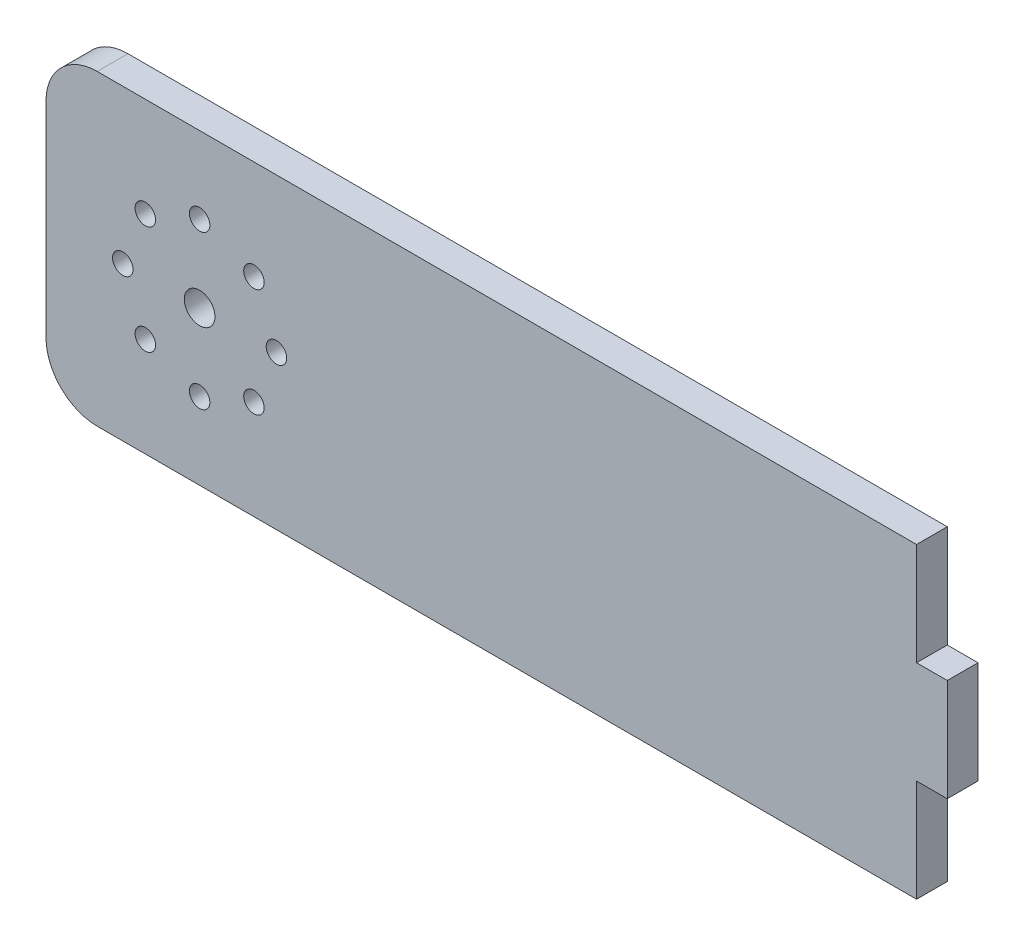
ISO-10303-21;
HEADER;
FILE_DESCRIPTION(('STEP AP214'),'2;1');
FILE_NAME('part.step','',(''),(''),'','','');
FILE_SCHEMA(('AUTOMOTIVE_DESIGN { 1 0 10303 214 1 1 1 1 }'));
ENDSEC;
DATA;
#1=APPLICATION_CONTEXT('core data for automotive mechanical design processes');
#2=APPLICATION_PROTOCOL_DEFINITION('international standard','automotive_design',2000,#1);
#3=PRODUCT_CONTEXT('',#1,'mechanical');
#4=PRODUCT('Part','Part','',(#3));
#5=PRODUCT_RELATED_PRODUCT_CATEGORY('part','',(#4));
#6=PRODUCT_DEFINITION_FORMATION('','',#4);
#7=PRODUCT_DEFINITION_CONTEXT('part definition',#1,'design');
#8=PRODUCT_DEFINITION('design','',#6,#7);
#9=PRODUCT_DEFINITION_SHAPE('','',#8);
#10=(LENGTH_UNIT() NAMED_UNIT(*) SI_UNIT(.MILLI.,.METRE.));
#11=(NAMED_UNIT(*) PLANE_ANGLE_UNIT() SI_UNIT($,.RADIAN.));
#12=(NAMED_UNIT(*) SI_UNIT($,.STERADIAN.) SOLID_ANGLE_UNIT());
#13=UNCERTAINTY_MEASURE_WITH_UNIT(LENGTH_MEASURE(1.E-05),#10,'distance_accuracy_value','');
#14=(GEOMETRIC_REPRESENTATION_CONTEXT(3) GLOBAL_UNCERTAINTY_ASSIGNED_CONTEXT((#13)) GLOBAL_UNIT_ASSIGNED_CONTEXT((#10,
#11,#12)) REPRESENTATION_CONTEXT('',''));
#15=CARTESIAN_POINT('',(0.,0.,0.));
#16=DIRECTION('',(0.,0.,1.));
#17=DIRECTION('',(1.,0.,0.));
#18=AXIS2_PLACEMENT_3D('',#15,#16,#17);
#19=CARTESIAN_POINT('',(0.,30.,3.));
#20=DIRECTION('',(0.,1.,0.));
#21=DIRECTION('',(0.,0.,1.));
#22=AXIS2_PLACEMENT_3D('',#19,#20,#21);
#23=PLANE('',#22);
#24=DIRECTION('',(1.,0.,0.));
#25=VECTOR('',#24,1.);
#26=CARTESIAN_POINT('',(0.,30.,0.));
#27=LINE('',#26,#25);
#28=CARTESIAN_POINT('',(5.,30.,0.));
#29=VERTEX_POINT('',#28);
#30=CARTESIAN_POINT('',(85.,30.,0.));
#31=VERTEX_POINT('',#30);
#32=EDGE_CURVE('E192',#29,#31,#27,.T.);
#33=ORIENTED_EDGE('',*,*,#32,.F.);
#34=DIRECTION('',(0.,0.,-1.));
#35=VECTOR('',#34,1.);
#36=CARTESIAN_POINT('',(5.,30.,3.));
#37=LINE('',#36,#35);
#38=CARTESIAN_POINT('',(5.,30.,3.));
#39=VERTEX_POINT('',#38);
#40=EDGE_CURVE('E11',#29,#39,#37,.F.);
#41=ORIENTED_EDGE('',*,*,#40,.T.);
#42=DIRECTION('',(1.,0.,0.));
#43=VECTOR('',#42,1.);
#44=CARTESIAN_POINT('',(0.,30.,3.));
#45=LINE('',#44,#43);
#46=CARTESIAN_POINT('',(85.,30.,3.));
#47=VERTEX_POINT('',#46);
#48=EDGE_CURVE('E179',#39,#47,#45,.T.);
#49=ORIENTED_EDGE('',*,*,#48,.T.);
#50=DIRECTION('',(0.,0.,-1.));
#51=VECTOR('',#50,1.);
#52=CARTESIAN_POINT('',(85.,30.,3.));
#53=LINE('',#52,#51);
#54=EDGE_CURVE('E211',#47,#31,#53,.T.);
#55=ORIENTED_EDGE('',*,*,#54,.T.);
#56=EDGE_LOOP('',(#33,#41,#49,#55));
#57=FACE_BOUND('',#56,.T.);
#58=ADVANCED_FACE('F41',(#57),#23,.T.);
#59=CARTESIAN_POINT('',(0.,0.,3.));
#60=DIRECTION('',(-1.,0.,0.));
#61=DIRECTION('',(0.,0.,1.));
#62=AXIS2_PLACEMENT_3D('',#59,#60,#61);
#63=PLANE('',#62);
#64=DIRECTION('',(0.,1.,0.));
#65=VECTOR('',#64,1.);
#66=CARTESIAN_POINT('',(0.,0.,0.));
#67=LINE('',#66,#65);
#68=CARTESIAN_POINT('',(0.,5.,0.));
#69=VERTEX_POINT('',#68);
#70=CARTESIAN_POINT('',(0.,25.,0.));
#71=VERTEX_POINT('',#70);
#72=EDGE_CURVE('E176',#69,#71,#67,.T.);
#73=ORIENTED_EDGE('',*,*,#72,.F.);
#74=DIRECTION('',(0.,0.,-1.));
#75=VECTOR('',#74,1.);
#76=CARTESIAN_POINT('',(0.,5.,3.));
#77=LINE('',#76,#75);
#78=CARTESIAN_POINT('',(0.,5.,3.));
#79=VERTEX_POINT('',#78);
#80=EDGE_CURVE('E165',#69,#79,#77,.F.);
#81=ORIENTED_EDGE('',*,*,#80,.T.);
#82=DIRECTION('',(0.,1.,0.));
#83=VECTOR('',#82,1.);
#84=CARTESIAN_POINT('',(0.,0.,3.));
#85=LINE('',#84,#83);
#86=CARTESIAN_POINT('',(0.,25.,3.));
#87=VERTEX_POINT('',#86);
#88=EDGE_CURVE('E129',#79,#87,#85,.T.);
#89=ORIENTED_EDGE('',*,*,#88,.T.);
#90=DIRECTION('',(0.,0.,-1.));
#91=VECTOR('',#90,1.);
#92=CARTESIAN_POINT('',(0.,25.,3.));
#93=LINE('',#92,#91);
#94=EDGE_CURVE('E161',#87,#71,#93,.T.);
#95=ORIENTED_EDGE('',*,*,#94,.T.);
#96=EDGE_LOOP('',(#73,#81,#89,#95));
#97=FACE_BOUND('',#96,.T.);
#98=ADVANCED_FACE('F173',(#97),#63,.T.);
#99=CARTESIAN_POINT('',(0.,0.,3.));
#100=DIRECTION('',(0.,1.,0.));
#101=DIRECTION('',(0.,0.,1.));
#102=AXIS2_PLACEMENT_3D('',#99,#100,#101);
#103=PLANE('',#102);
#104=DIRECTION('',(1.,0.,0.));
#105=VECTOR('',#104,1.);
#106=CARTESIAN_POINT('',(0.,0.,3.));
#107=LINE('',#106,#105);
#108=CARTESIAN_POINT('',(5.,0.,3.));
#109=VERTEX_POINT('',#108);
#110=CARTESIAN_POINT('',(85.,0.,3.));
#111=VERTEX_POINT('',#110);
#112=EDGE_CURVE('E117',#109,#111,#107,.T.);
#113=ORIENTED_EDGE('',*,*,#112,.F.);
#114=DIRECTION('',(0.,0.,-1.));
#115=VECTOR('',#114,1.);
#116=CARTESIAN_POINT('',(5.,0.,0.));
#117=LINE('',#116,#115);
#118=CARTESIAN_POINT('',(5.,0.,0.));
#119=VERTEX_POINT('',#118);
#120=EDGE_CURVE('E146',#109,#119,#117,.T.);
#121=ORIENTED_EDGE('',*,*,#120,.T.);
#122=DIRECTION('',(1.,0.,0.));
#123=VECTOR('',#122,1.);
#124=CARTESIAN_POINT('',(0.,0.,0.));
#125=LINE('',#124,#123);
#126=CARTESIAN_POINT('',(85.,0.,0.));
#127=VERTEX_POINT('',#126);
#128=EDGE_CURVE('E143',#119,#127,#125,.T.);
#129=ORIENTED_EDGE('',*,*,#128,.T.);
#130=DIRECTION('',(0.,0.,-1.));
#131=VECTOR('',#130,1.);
#132=CARTESIAN_POINT('',(85.,0.,3.));
#133=LINE('',#132,#131);
#134=EDGE_CURVE('E135',#111,#127,#133,.T.);
#135=ORIENTED_EDGE('',*,*,#134,.F.);
#136=EDGE_LOOP('',(#113,#121,#129,#135));
#137=FACE_BOUND('',#136,.T.);
#138=ADVANCED_FACE('F141',(#137),#103,.F.);
#139=CARTESIAN_POINT('',(85.,0.,3.));
#140=DIRECTION('',(-1.,0.,0.));
#141=DIRECTION('',(0.,0.,1.));
#142=AXIS2_PLACEMENT_3D('',#139,#140,#141);
#143=PLANE('',#142);
#144=DIRECTION('',(0.,1.,0.));
#145=VECTOR('',#144,1.);
#146=CARTESIAN_POINT('',(85.,0.,0.));
#147=LINE('',#146,#145);
#148=CARTESIAN_POINT('',(85.,10.,0.));
#149=VERTEX_POINT('',#148);
#150=EDGE_CURVE('E185',#127,#149,#147,.T.);
#151=ORIENTED_EDGE('',*,*,#150,.T.);
#152=DIRECTION('',(0.,0.,-1.));
#153=VECTOR('',#152,1.);
#154=CARTESIAN_POINT('',(85.,10.,3.));
#155=LINE('',#154,#153);
#156=CARTESIAN_POINT('',(85.,10.,3.));
#157=VERTEX_POINT('',#156);
#158=EDGE_CURVE('E136',#157,#149,#155,.T.);
#159=ORIENTED_EDGE('',*,*,#158,.F.);
#160=DIRECTION('',(0.,1.,0.));
#161=VECTOR('',#160,1.);
#162=CARTESIAN_POINT('',(85.,0.,3.));
#163=LINE('',#162,#161);
#164=EDGE_CURVE('E121',#111,#157,#163,.T.);
#165=ORIENTED_EDGE('',*,*,#164,.F.);
#166=ORIENTED_EDGE('',*,*,#134,.T.);
#167=EDGE_LOOP('',(#151,#159,#165,#166));
#168=FACE_BOUND('',#167,.T.);
#169=ADVANCED_FACE('F134',(#168),#143,.F.);
#170=CARTESIAN_POINT('',(0.,10.,3.));
#171=DIRECTION('',(0.,-1.,0.));
#172=DIRECTION('',(0.,0.,-1.));
#173=AXIS2_PLACEMENT_3D('',#170,#171,#172);
#174=PLANE('',#173);
#175=DIRECTION('',(-1.,0.,0.));
#176=VECTOR('',#175,1.);
#177=CARTESIAN_POINT('',(0.,10.,0.));
#178=LINE('',#177,#176);
#179=CARTESIAN_POINT('',(88.,10.,0.));
#180=VERTEX_POINT('',#179);
#181=EDGE_CURVE('E190',#180,#149,#178,.T.);
#182=ORIENTED_EDGE('',*,*,#181,.F.);
#183=DIRECTION('',(0.,0.,-1.));
#184=VECTOR('',#183,1.);
#185=CARTESIAN_POINT('',(88.,10.,3.));
#186=LINE('',#185,#184);
#187=CARTESIAN_POINT('',(88.,10.,3.));
#188=VERTEX_POINT('',#187);
#189=EDGE_CURVE('E152',#188,#180,#186,.T.);
#190=ORIENTED_EDGE('',*,*,#189,.F.);
#191=DIRECTION('',(-1.,0.,0.));
#192=VECTOR('',#191,1.);
#193=CARTESIAN_POINT('',(0.,10.,3.));
#194=LINE('',#193,#192);
#195=EDGE_CURVE('E139',#188,#157,#194,.T.);
#196=ORIENTED_EDGE('',*,*,#195,.T.);
#197=ORIENTED_EDGE('',*,*,#158,.T.);
#198=EDGE_LOOP('',(#182,#190,#196,#197));
#199=FACE_BOUND('',#198,.T.);
#200=ADVANCED_FACE('F230',(#199),#174,.T.);
#201=CARTESIAN_POINT('',(88.,1.22124532708767E-13,3.));
#202=DIRECTION('',(1.,0.,0.));
#203=DIRECTION('',(0.,1.,0.));
#204=AXIS2_PLACEMENT_3D('',#201,#202,#203);
#205=PLANE('',#204);
#206=DIRECTION('',(0.,-1.,0.));
#207=VECTOR('',#206,1.);
#208=CARTESIAN_POINT('',(88.,1.22124532708767E-13,0.));
#209=LINE('',#208,#207);
#210=CARTESIAN_POINT('',(88.,20.,0.));
#211=VERTEX_POINT('',#210);
#212=EDGE_CURVE('E198',#211,#180,#209,.T.);
#213=ORIENTED_EDGE('',*,*,#212,.F.);
#214=DIRECTION('',(0.,0.,-1.));
#215=VECTOR('',#214,1.);
#216=CARTESIAN_POINT('',(88.,20.,3.));
#217=LINE('',#216,#215);
#218=CARTESIAN_POINT('',(88.,20.,3.));
#219=VERTEX_POINT('',#218);
#220=EDGE_CURVE('E219',#219,#211,#217,.T.);
#221=ORIENTED_EDGE('',*,*,#220,.F.);
#222=DIRECTION('',(0.,-1.,0.));
#223=VECTOR('',#222,1.);
#224=CARTESIAN_POINT('',(88.,1.22124532708767E-13,3.));
#225=LINE('',#224,#223);
#226=EDGE_CURVE('E228',#219,#188,#225,.T.);
#227=ORIENTED_EDGE('',*,*,#226,.T.);
#228=ORIENTED_EDGE('',*,*,#189,.T.);
#229=EDGE_LOOP('',(#213,#221,#227,#228));
#230=FACE_BOUND('',#229,.T.);
#231=ADVANCED_FACE('F226',(#230),#205,.T.);
#232=CARTESIAN_POINT('',(0.,20.,3.));
#233=DIRECTION('',(0.,1.,0.));
#234=DIRECTION('',(0.,0.,1.));
#235=AXIS2_PLACEMENT_3D('',#232,#233,#234);
#236=PLANE('',#235);
#237=DIRECTION('',(1.,0.,0.));
#238=VECTOR('',#237,1.);
#239=CARTESIAN_POINT('',(0.,20.,0.));
#240=LINE('',#239,#238);
#241=CARTESIAN_POINT('',(85.,20.,0.));
#242=VERTEX_POINT('',#241);
#243=EDGE_CURVE('E202',#242,#211,#240,.T.);
#244=ORIENTED_EDGE('',*,*,#243,.F.);
#245=DIRECTION('',(0.,0.,-1.));
#246=VECTOR('',#245,1.);
#247=CARTESIAN_POINT('',(85.,20.,3.));
#248=LINE('',#247,#246);
#249=CARTESIAN_POINT('',(85.,20.,3.));
#250=VERTEX_POINT('',#249);
#251=EDGE_CURVE('E215',#250,#242,#248,.T.);
#252=ORIENTED_EDGE('',*,*,#251,.F.);
#253=DIRECTION('',(1.,0.,0.));
#254=VECTOR('',#253,1.);
#255=CARTESIAN_POINT('',(0.,20.,3.));
#256=LINE('',#255,#254);
#257=EDGE_CURVE('E237',#250,#219,#256,.T.);
#258=ORIENTED_EDGE('',*,*,#257,.T.);
#259=ORIENTED_EDGE('',*,*,#220,.T.);
#260=EDGE_LOOP('',(#244,#252,#258,#259));
#261=FACE_BOUND('',#260,.T.);
#262=ADVANCED_FACE('F234',(#261),#236,.T.);
#263=CARTESIAN_POINT('',(9.6966991411009,20.3033008588991,3.));
#264=DIRECTION('',(0.,0.,-1.));
#265=DIRECTION('',(-1.,0.,0.));
#266=AXIS2_PLACEMENT_3D('',#263,#264,#265);
#267=CYLINDRICAL_SURFACE('',#266,1.);
#268=CARTESIAN_POINT('',(9.6966991411009,20.3033008588991,3.));
#269=DIRECTION('',(0.,0.,1.));
#270=DIRECTION('',(1.,0.,0.));
#271=AXIS2_PLACEMENT_3D('',#268,#269,#270);
#272=CIRCLE('',#271,1.);
#273=CARTESIAN_POINT('',(10.6966991411009,20.3033008588991,3.));
#274=VERTEX_POINT('',#273);
#275=EDGE_CURVE('E289',#274,#274,#272,.T.);
#276=ORIENTED_EDGE('',*,*,#275,.T.);
#277=EDGE_LOOP('',(#276));
#278=FACE_BOUND('',#277,.T.);
#279=CARTESIAN_POINT('',(9.6966991411009,20.3033008588991,0.));
#280=DIRECTION('',(0.,0.,1.));
#281=DIRECTION('',(1.,0.,0.));
#282=AXIS2_PLACEMENT_3D('',#279,#280,#281);
#283=CIRCLE('',#282,1.);
#284=CARTESIAN_POINT('',(10.6966991411009,20.3033008588991,0.));
#285=VERTEX_POINT('',#284);
#286=EDGE_CURVE('E281',#285,#285,#283,.T.);
#287=ORIENTED_EDGE('',*,*,#286,.F.);
#288=EDGE_LOOP('',(#287));
#289=FACE_BOUND('',#288,.T.);
#290=ADVANCED_FACE('F304',(#278,#289),#267,.F.);
#291=CARTESIAN_POINT('',(15.,22.5,3.));
#292=DIRECTION('',(0.,0.,-1.));
#293=DIRECTION('',(-1.,0.,0.));
#294=AXIS2_PLACEMENT_3D('',#291,#292,#293);
#295=CYLINDRICAL_SURFACE('',#294,1.);
#296=CARTESIAN_POINT('',(15.,22.5,3.));
#297=DIRECTION('',(0.,0.,1.));
#298=DIRECTION('',(1.,0.,0.));
#299=AXIS2_PLACEMENT_3D('',#296,#297,#298);
#300=CIRCLE('',#299,1.);
#301=CARTESIAN_POINT('',(16.,22.5,3.));
#302=VERTEX_POINT('',#301);
#303=EDGE_CURVE('E537',#302,#302,#300,.T.);
#304=ORIENTED_EDGE('',*,*,#303,.T.);
#305=EDGE_LOOP('',(#304));
#306=FACE_BOUND('',#305,.T.);
#307=CARTESIAN_POINT('',(15.,22.5,0.));
#308=DIRECTION('',(0.,0.,1.));
#309=DIRECTION('',(1.,0.,0.));
#310=AXIS2_PLACEMENT_3D('',#307,#308,#309);
#311=CIRCLE('',#310,1.);
#312=CARTESIAN_POINT('',(16.,22.5,0.));
#313=VERTEX_POINT('',#312);
#314=EDGE_CURVE('E277',#313,#313,#311,.T.);
#315=ORIENTED_EDGE('',*,*,#314,.F.);
#316=EDGE_LOOP('',(#315));
#317=FACE_BOUND('',#316,.T.);
#318=ADVANCED_FACE('F307',(#306,#317),#295,.F.);
#319=CARTESIAN_POINT('',(20.3033008588991,20.3033008588991,3.));
#320=DIRECTION('',(0.,0.,-1.));
#321=DIRECTION('',(-1.,0.,0.));
#322=AXIS2_PLACEMENT_3D('',#319,#320,#321);
#323=CYLINDRICAL_SURFACE('',#322,1.);
#324=CARTESIAN_POINT('',(20.3033008588991,20.3033008588991,3.));
#325=DIRECTION('',(0.,0.,1.));
#326=DIRECTION('',(1.,0.,0.));
#327=AXIS2_PLACEMENT_3D('',#324,#325,#326);
#328=CIRCLE('',#327,1.);
#329=CARTESIAN_POINT('',(21.3033008588991,20.3033008588991,3.));
#330=VERTEX_POINT('',#329);
#331=EDGE_CURVE('E533',#330,#330,#328,.T.);
#332=ORIENTED_EDGE('',*,*,#331,.T.);
#333=EDGE_LOOP('',(#332));
#334=FACE_BOUND('',#333,.T.);
#335=CARTESIAN_POINT('',(20.3033008588991,20.3033008588991,0.));
#336=DIRECTION('',(0.,0.,1.));
#337=DIRECTION('',(1.,0.,0.));
#338=AXIS2_PLACEMENT_3D('',#335,#336,#337);
#339=CIRCLE('',#338,1.);
#340=CARTESIAN_POINT('',(21.3033008588991,20.3033008588991,0.));
#341=VERTEX_POINT('',#340);
#342=EDGE_CURVE('E273',#341,#341,#339,.T.);
#343=ORIENTED_EDGE('',*,*,#342,.F.);
#344=EDGE_LOOP('',(#343));
#345=FACE_BOUND('',#344,.T.);
#346=ADVANCED_FACE('F311',(#334,#345),#323,.F.);
#347=CARTESIAN_POINT('',(22.5,14.9999999999999,3.));
#348=DIRECTION('',(0.,0.,-1.));
#349=DIRECTION('',(-1.,0.,0.));
#350=AXIS2_PLACEMENT_3D('',#347,#348,#349);
#351=CYLINDRICAL_SURFACE('',#350,1.);
#352=CARTESIAN_POINT('',(22.5,14.9999999999999,3.));
#353=DIRECTION('',(0.,0.,1.));
#354=DIRECTION('',(1.,0.,0.));
#355=AXIS2_PLACEMENT_3D('',#352,#353,#354);
#356=CIRCLE('',#355,1.);
#357=CARTESIAN_POINT('',(23.5,14.9999999999999,3.));
#358=VERTEX_POINT('',#357);
#359=EDGE_CURVE('E529',#358,#358,#356,.T.);
#360=ORIENTED_EDGE('',*,*,#359,.T.);
#361=EDGE_LOOP('',(#360));
#362=FACE_BOUND('',#361,.T.);
#363=CARTESIAN_POINT('',(22.5,14.9999999999999,0.));
#364=DIRECTION('',(0.,0.,1.));
#365=DIRECTION('',(1.,0.,0.));
#366=AXIS2_PLACEMENT_3D('',#363,#364,#365);
#367=CIRCLE('',#366,1.);
#368=CARTESIAN_POINT('',(23.5,14.9999999999999,0.));
#369=VERTEX_POINT('',#368);
#370=EDGE_CURVE('E269',#369,#369,#367,.T.);
#371=ORIENTED_EDGE('',*,*,#370,.F.);
#372=EDGE_LOOP('',(#371));
#373=FACE_BOUND('',#372,.T.);
#374=ADVANCED_FACE('F315',(#362,#373),#351,.F.);
#375=CARTESIAN_POINT('',(20.3033008588991,9.69669914110085,3.));
#376=DIRECTION('',(0.,0.,-1.));
#377=DIRECTION('',(-1.,0.,0.));
#378=AXIS2_PLACEMENT_3D('',#375,#376,#377);
#379=CYLINDRICAL_SURFACE('',#378,1.);
#380=CARTESIAN_POINT('',(20.3033008588991,9.69669914110085,3.));
#381=DIRECTION('',(0.,0.,1.));
#382=DIRECTION('',(1.,0.,0.));
#383=AXIS2_PLACEMENT_3D('',#380,#381,#382);
#384=CIRCLE('',#383,1.);
#385=CARTESIAN_POINT('',(21.3033008588991,9.69669914110085,3.));
#386=VERTEX_POINT('',#385);
#387=EDGE_CURVE('E525',#386,#386,#384,.T.);
#388=ORIENTED_EDGE('',*,*,#387,.T.);
#389=EDGE_LOOP('',(#388));
#390=FACE_BOUND('',#389,.T.);
#391=CARTESIAN_POINT('',(20.3033008588991,9.69669914110085,0.));
#392=DIRECTION('',(0.,0.,1.));
#393=DIRECTION('',(1.,0.,0.));
#394=AXIS2_PLACEMENT_3D('',#391,#392,#393);
#395=CIRCLE('',#394,1.);
#396=CARTESIAN_POINT('',(21.3033008588991,9.69669914110085,0.));
#397=VERTEX_POINT('',#396);
#398=EDGE_CURVE('E265',#397,#397,#395,.T.);
#399=ORIENTED_EDGE('',*,*,#398,.F.);
#400=EDGE_LOOP('',(#399));
#401=FACE_BOUND('',#400,.T.);
#402=ADVANCED_FACE('F319',(#390,#401),#379,.F.);
#403=CARTESIAN_POINT('',(14.9999999999999,7.5,3.));
#404=DIRECTION('',(0.,0.,-1.));
#405=DIRECTION('',(-1.,0.,0.));
#406=AXIS2_PLACEMENT_3D('',#403,#404,#405);
#407=CYLINDRICAL_SURFACE('',#406,1.);
#408=CARTESIAN_POINT('',(14.9999999999999,7.5,3.));
#409=DIRECTION('',(0.,0.,1.));
#410=DIRECTION('',(1.,0.,0.));
#411=AXIS2_PLACEMENT_3D('',#408,#409,#410);
#412=CIRCLE('',#411,1.);
#413=CARTESIAN_POINT('',(15.9999999999999,7.5,3.));
#414=VERTEX_POINT('',#413);
#415=EDGE_CURVE('E521',#414,#414,#412,.T.);
#416=ORIENTED_EDGE('',*,*,#415,.T.);
#417=EDGE_LOOP('',(#416));
#418=FACE_BOUND('',#417,.T.);
#419=CARTESIAN_POINT('',(14.9999999999999,7.5,0.));
#420=DIRECTION('',(0.,0.,1.));
#421=DIRECTION('',(1.,0.,0.));
#422=AXIS2_PLACEMENT_3D('',#419,#420,#421);
#423=CIRCLE('',#422,1.);
#424=CARTESIAN_POINT('',(15.9999999999999,7.5,0.));
#425=VERTEX_POINT('',#424);
#426=EDGE_CURVE('E261',#425,#425,#423,.T.);
#427=ORIENTED_EDGE('',*,*,#426,.F.);
#428=EDGE_LOOP('',(#427));
#429=FACE_BOUND('',#428,.T.);
#430=ADVANCED_FACE('F323',(#418,#429),#407,.F.);
#431=CARTESIAN_POINT('',(9.69669914110083,9.69669914110096,3.));
#432=DIRECTION('',(0.,0.,-1.));
#433=DIRECTION('',(-1.,0.,0.));
#434=AXIS2_PLACEMENT_3D('',#431,#432,#433);
#435=CYLINDRICAL_SURFACE('',#434,0.999999999999999);
#436=CARTESIAN_POINT('',(9.69669914110083,9.69669914110096,3.));
#437=DIRECTION('',(0.,0.,1.));
#438=DIRECTION('',(1.,0.,0.));
#439=AXIS2_PLACEMENT_3D('',#436,#437,#438);
#440=CIRCLE('',#439,0.999999999999999);
#441=CARTESIAN_POINT('',(10.6966991411008,9.69669914110096,3.));
#442=VERTEX_POINT('',#441);
#443=EDGE_CURVE('E517',#442,#442,#440,.T.);
#444=ORIENTED_EDGE('',*,*,#443,.T.);
#445=EDGE_LOOP('',(#444));
#446=FACE_BOUND('',#445,.T.);
#447=CARTESIAN_POINT('',(9.69669914110083,9.69669914110096,0.));
#448=DIRECTION('',(0.,0.,1.));
#449=DIRECTION('',(1.,0.,0.));
#450=AXIS2_PLACEMENT_3D('',#447,#448,#449);
#451=CIRCLE('',#450,0.999999999999999);
#452=CARTESIAN_POINT('',(10.6966991411008,9.69669914110096,0.));
#453=VERTEX_POINT('',#452);
#454=EDGE_CURVE('E257',#453,#453,#451,.T.);
#455=ORIENTED_EDGE('',*,*,#454,.F.);
#456=EDGE_LOOP('',(#455));
#457=FACE_BOUND('',#456,.T.);
#458=ADVANCED_FACE('F327',(#446,#457),#435,.F.);
#459=CARTESIAN_POINT('',(7.5,15.,3.));
#460=DIRECTION('',(0.,0.,-1.));
#461=DIRECTION('',(-1.,0.,0.));
#462=AXIS2_PLACEMENT_3D('',#459,#460,#461);
#463=CYLINDRICAL_SURFACE('',#462,1.);
#464=CARTESIAN_POINT('',(7.5,15.,3.));
#465=DIRECTION('',(0.,0.,1.));
#466=DIRECTION('',(1.,0.,0.));
#467=AXIS2_PLACEMENT_3D('',#464,#465,#466);
#468=CIRCLE('',#467,1.);
#469=CARTESIAN_POINT('',(8.5,15.,3.));
#470=VERTEX_POINT('',#469);
#471=EDGE_CURVE('E513',#470,#470,#468,.T.);
#472=ORIENTED_EDGE('',*,*,#471,.T.);
#473=EDGE_LOOP('',(#472));
#474=FACE_BOUND('',#473,.T.);
#475=CARTESIAN_POINT('',(7.5,15.,0.));
#476=DIRECTION('',(0.,0.,1.));
#477=DIRECTION('',(1.,0.,0.));
#478=AXIS2_PLACEMENT_3D('',#475,#476,#477);
#479=CIRCLE('',#478,1.);
#480=CARTESIAN_POINT('',(8.5,15.,0.));
#481=VERTEX_POINT('',#480);
#482=EDGE_CURVE('E253',#481,#481,#479,.T.);
#483=ORIENTED_EDGE('',*,*,#482,.F.);
#484=EDGE_LOOP('',(#483));
#485=FACE_BOUND('',#484,.T.);
#486=ADVANCED_FACE('F331',(#474,#485),#463,.F.);
#487=CARTESIAN_POINT('',(15.,15.,3.));
#488=DIRECTION('',(0.,0.,-1.));
#489=DIRECTION('',(-1.,0.,0.));
#490=AXIS2_PLACEMENT_3D('',#487,#488,#489);
#491=CYLINDRICAL_SURFACE('',#490,1.5);
#492=CARTESIAN_POINT('',(15.,15.,3.));
#493=DIRECTION('',(0.,0.,1.));
#494=DIRECTION('',(1.,0.,0.));
#495=AXIS2_PLACEMENT_3D('',#492,#493,#494);
#496=CIRCLE('',#495,1.5);
#497=CARTESIAN_POINT('',(16.5,15.,3.));
#498=VERTEX_POINT('',#497);
#499=EDGE_CURVE('E210',#498,#498,#496,.T.);
#500=ORIENTED_EDGE('',*,*,#499,.T.);
#501=EDGE_LOOP('',(#500));
#502=FACE_BOUND('',#501,.T.);
#503=CARTESIAN_POINT('',(15.,15.,0.));
#504=DIRECTION('',(0.,0.,1.));
#505=DIRECTION('',(1.,0.,0.));
#506=AXIS2_PLACEMENT_3D('',#503,#504,#505);
#507=CIRCLE('',#506,1.5);
#508=CARTESIAN_POINT('',(16.5,15.,0.));
#509=VERTEX_POINT('',#508);
#510=EDGE_CURVE('E249',#509,#509,#507,.T.);
#511=ORIENTED_EDGE('',*,*,#510,.F.);
#512=EDGE_LOOP('',(#511));
#513=FACE_BOUND('',#512,.T.);
#514=ADVANCED_FACE('F335',(#502,#513),#491,.F.);
#515=CARTESIAN_POINT('',(85.,0.,3.));
#516=DIRECTION('',(1.,0.,0.));
#517=DIRECTION('',(0.,0.,-1.));
#518=AXIS2_PLACEMENT_3D('',#515,#516,#517);
#519=PLANE('',#518);
#520=DIRECTION('',(0.,-1.,0.));
#521=VECTOR('',#520,1.);
#522=CARTESIAN_POINT('',(85.,0.,0.));
#523=LINE('',#522,#521);
#524=EDGE_CURVE('E206',#31,#242,#523,.T.);
#525=ORIENTED_EDGE('',*,*,#524,.F.);
#526=ORIENTED_EDGE('',*,*,#54,.F.);
#527=DIRECTION('',(0.,-1.,0.));
#528=VECTOR('',#527,1.);
#529=CARTESIAN_POINT('',(85.,0.,3.));
#530=LINE('',#529,#528);
#531=EDGE_CURVE('E216',#47,#250,#530,.T.);
#532=ORIENTED_EDGE('',*,*,#531,.T.);
#533=ORIENTED_EDGE('',*,*,#251,.T.);
#534=EDGE_LOOP('',(#525,#526,#532,#533));
#535=FACE_BOUND('',#534,.T.);
#536=ADVANCED_FACE('F287',(#535),#519,.T.);
#537=CARTESIAN_POINT('',(0.,0.,3.));
#538=DIRECTION('',(0.,0.,1.));
#539=DIRECTION('',(1.,0.,0.));
#540=AXIS2_PLACEMENT_3D('',#537,#538,#539);
#541=PLANE('',#540);
#542=ORIENTED_EDGE('',*,*,#499,.F.);
#543=EDGE_LOOP('',(#542));
#544=FACE_BOUND('',#543,.T.);
#545=ORIENTED_EDGE('',*,*,#471,.F.);
#546=EDGE_LOOP('',(#545));
#547=FACE_BOUND('',#546,.T.);
#548=ORIENTED_EDGE('',*,*,#443,.F.);
#549=EDGE_LOOP('',(#548));
#550=FACE_BOUND('',#549,.T.);
#551=ORIENTED_EDGE('',*,*,#415,.F.);
#552=EDGE_LOOP('',(#551));
#553=FACE_BOUND('',#552,.T.);
#554=ORIENTED_EDGE('',*,*,#387,.F.);
#555=EDGE_LOOP('',(#554));
#556=FACE_BOUND('',#555,.T.);
#557=ORIENTED_EDGE('',*,*,#359,.F.);
#558=EDGE_LOOP('',(#557));
#559=FACE_BOUND('',#558,.T.);
#560=ORIENTED_EDGE('',*,*,#331,.F.);
#561=EDGE_LOOP('',(#560));
#562=FACE_BOUND('',#561,.T.);
#563=ORIENTED_EDGE('',*,*,#303,.F.);
#564=EDGE_LOOP('',(#563));
#565=FACE_BOUND('',#564,.T.);
#566=ORIENTED_EDGE('',*,*,#275,.F.);
#567=EDGE_LOOP('',(#566));
#568=FACE_BOUND('',#567,.T.);
#569=ORIENTED_EDGE('',*,*,#88,.F.);
#570=CARTESIAN_POINT('',(5.,5.,3.));
#571=DIRECTION('',(0.,0.,1.));
#572=DIRECTION('',(1.,0.,0.));
#573=AXIS2_PLACEMENT_3D('',#570,#571,#572);
#574=CIRCLE('',#573,5.);
#575=EDGE_CURVE('E50',#79,#109,#574,.T.);
#576=ORIENTED_EDGE('',*,*,#575,.T.);
#577=ORIENTED_EDGE('',*,*,#112,.T.);
#578=ORIENTED_EDGE('',*,*,#164,.T.);
#579=ORIENTED_EDGE('',*,*,#195,.F.);
#580=ORIENTED_EDGE('',*,*,#226,.F.);
#581=ORIENTED_EDGE('',*,*,#257,.F.);
#582=ORIENTED_EDGE('',*,*,#531,.F.);
#583=ORIENTED_EDGE('',*,*,#48,.F.);
#584=CARTESIAN_POINT('',(5.,25.,3.));
#585=DIRECTION('',(0.,0.,1.));
#586=DIRECTION('',(1.,0.,0.));
#587=AXIS2_PLACEMENT_3D('',#584,#585,#586);
#588=CIRCLE('',#587,5.);
#589=EDGE_CURVE('E62',#39,#87,#588,.T.);
#590=ORIENTED_EDGE('',*,*,#589,.T.);
#591=EDGE_LOOP('',(#569,#576,#577,#578,#579,#580,#581,#582,#583,#590));
#592=FACE_BOUND('',#591,.T.);
#593=ADVANCED_FACE('F119',(#544,#547,#550,#553,#556,#559,#562,#565,#568,#592),#541,.T.);
#594=CARTESIAN_POINT('',(0.,0.,0.));
#595=DIRECTION('',(0.,0.,1.));
#596=DIRECTION('',(1.,0.,0.));
#597=AXIS2_PLACEMENT_3D('',#594,#595,#596);
#598=PLANE('',#597);
#599=ORIENTED_EDGE('',*,*,#510,.T.);
#600=EDGE_LOOP('',(#599));
#601=FACE_BOUND('',#600,.T.);
#602=ORIENTED_EDGE('',*,*,#482,.T.);
#603=EDGE_LOOP('',(#602));
#604=FACE_BOUND('',#603,.T.);
#605=ORIENTED_EDGE('',*,*,#454,.T.);
#606=EDGE_LOOP('',(#605));
#607=FACE_BOUND('',#606,.T.);
#608=ORIENTED_EDGE('',*,*,#426,.T.);
#609=EDGE_LOOP('',(#608));
#610=FACE_BOUND('',#609,.T.);
#611=ORIENTED_EDGE('',*,*,#398,.T.);
#612=EDGE_LOOP('',(#611));
#613=FACE_BOUND('',#612,.T.);
#614=ORIENTED_EDGE('',*,*,#370,.T.);
#615=EDGE_LOOP('',(#614));
#616=FACE_BOUND('',#615,.T.);
#617=ORIENTED_EDGE('',*,*,#342,.T.);
#618=EDGE_LOOP('',(#617));
#619=FACE_BOUND('',#618,.T.);
#620=ORIENTED_EDGE('',*,*,#314,.T.);
#621=EDGE_LOOP('',(#620));
#622=FACE_BOUND('',#621,.T.);
#623=ORIENTED_EDGE('',*,*,#286,.T.);
#624=EDGE_LOOP('',(#623));
#625=FACE_BOUND('',#624,.T.);
#626=ORIENTED_EDGE('',*,*,#128,.F.);
#627=CARTESIAN_POINT('',(5.,5.,0.));
#628=DIRECTION('',(0.,0.,1.));
#629=DIRECTION('',(1.,0.,0.));
#630=AXIS2_PLACEMENT_3D('',#627,#628,#629);
#631=CIRCLE('',#630,5.);
#632=EDGE_CURVE('E158',#119,#69,#631,.F.);
#633=ORIENTED_EDGE('',*,*,#632,.T.);
#634=ORIENTED_EDGE('',*,*,#72,.T.);
#635=CARTESIAN_POINT('',(5.,25.,0.));
#636=DIRECTION('',(0.,0.,1.));
#637=DIRECTION('',(1.,0.,0.));
#638=AXIS2_PLACEMENT_3D('',#635,#636,#637);
#639=CIRCLE('',#638,5.);
#640=EDGE_CURVE('E150',#71,#29,#639,.F.);
#641=ORIENTED_EDGE('',*,*,#640,.T.);
#642=ORIENTED_EDGE('',*,*,#32,.T.);
#643=ORIENTED_EDGE('',*,*,#524,.T.);
#644=ORIENTED_EDGE('',*,*,#243,.T.);
#645=ORIENTED_EDGE('',*,*,#212,.T.);
#646=ORIENTED_EDGE('',*,*,#181,.T.);
#647=ORIENTED_EDGE('',*,*,#150,.F.);
#648=EDGE_LOOP('',(#626,#633,#634,#641,#642,#643,#644,#645,#646,#647));
#649=FACE_BOUND('',#648,.T.);
#650=ADVANCED_FACE('F183',(#601,#604,#607,#610,#613,#616,#619,#622,#625,#649),#598,.F.);
#651=CARTESIAN_POINT('',(5.,5.,3.));
#652=DIRECTION('',(0.,0.,1.));
#653=DIRECTION('',(1.,0.,0.));
#654=AXIS2_PLACEMENT_3D('',#651,#652,#653);
#655=CYLINDRICAL_SURFACE('',#654,5.);
#656=ORIENTED_EDGE('',*,*,#575,.F.);
#657=ORIENTED_EDGE('',*,*,#80,.F.);
#658=ORIENTED_EDGE('',*,*,#632,.F.);
#659=ORIENTED_EDGE('',*,*,#120,.F.);
#660=EDGE_LOOP('',(#656,#657,#658,#659));
#661=FACE_BOUND('',#660,.T.);
#662=ADVANCED_FACE('F181',(#661),#655,.T.);
#663=CARTESIAN_POINT('',(5.,25.,3.));
#664=DIRECTION('',(0.,0.,-1.));
#665=DIRECTION('',(-1.,0.,0.));
#666=AXIS2_PLACEMENT_3D('',#663,#664,#665);
#667=CYLINDRICAL_SURFACE('',#666,5.);
#668=ORIENTED_EDGE('',*,*,#589,.F.);
#669=ORIENTED_EDGE('',*,*,#40,.F.);
#670=ORIENTED_EDGE('',*,*,#640,.F.);
#671=ORIENTED_EDGE('',*,*,#94,.F.);
#672=EDGE_LOOP('',(#668,#669,#670,#671));
#673=FACE_BOUND('',#672,.T.);
#674=ADVANCED_FACE('F43',(#673),#667,.T.);
#675=CLOSED_SHELL('',(#58,#98,#138,#169,#200,#231,#262,#290,#318,#346,#374,#402,#430,#458,#486,
#514,#536,#593,#650,#662,#674));
#676=MANIFOLD_SOLID_BREP('B2',#675);
#677=ADVANCED_BREP_SHAPE_REPRESENTATION('',(#18,#676),#14);
#678=SHAPE_DEFINITION_REPRESENTATION(#9,#677);
ENDSEC;
END-ISO-10303-21;
